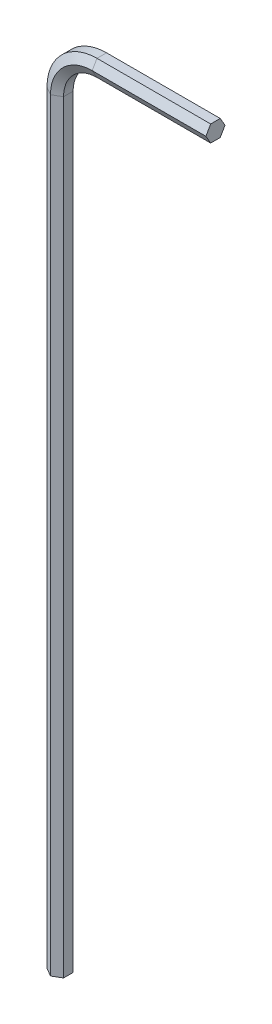
ISO-10303-21;
HEADER;
FILE_DESCRIPTION(('STEP AP214'),'2;1');
FILE_NAME('part.step','',(''),(''),'','','');
FILE_SCHEMA(('AUTOMOTIVE_DESIGN { 1 0 10303 214 1 1 1 1 }'));
ENDSEC;
DATA;
#1=APPLICATION_CONTEXT('core data for automotive mechanical design processes');
#2=APPLICATION_PROTOCOL_DEFINITION('international standard','automotive_design',2000,#1);
#3=PRODUCT_CONTEXT('',#1,'mechanical');
#4=PRODUCT('Part','Part','',(#3));
#5=PRODUCT_RELATED_PRODUCT_CATEGORY('part','',(#4));
#6=PRODUCT_DEFINITION_FORMATION('','',#4);
#7=PRODUCT_DEFINITION_CONTEXT('part definition',#1,'design');
#8=PRODUCT_DEFINITION('design','',#6,#7);
#9=PRODUCT_DEFINITION_SHAPE('','',#8);
#10=(LENGTH_UNIT() NAMED_UNIT(*) SI_UNIT(.MILLI.,.METRE.));
#11=(NAMED_UNIT(*) PLANE_ANGLE_UNIT() SI_UNIT($,.RADIAN.));
#12=(NAMED_UNIT(*) SI_UNIT($,.STERADIAN.) SOLID_ANGLE_UNIT());
#13=UNCERTAINTY_MEASURE_WITH_UNIT(LENGTH_MEASURE(1.E-05),#10,'distance_accuracy_value','');
#14=(GEOMETRIC_REPRESENTATION_CONTEXT(3) GLOBAL_UNCERTAINTY_ASSIGNED_CONTEXT((#13)) GLOBAL_UNIT_ASSIGNED_CONTEXT((#10,
#11,#12)) REPRESENTATION_CONTEXT('',''));
#15=CARTESIAN_POINT('',(0.,0.,0.));
#16=DIRECTION('',(0.,0.,1.));
#17=DIRECTION('',(1.,0.,0.));
#18=AXIS2_PLACEMENT_3D('',#15,#16,#17);
#19=CARTESIAN_POINT('',(4.00000000000003,77.20625,-0.91654355233853));
#20=DIRECTION('',(0.,0.500000000000001,-0.866025403784438));
#21=DIRECTION('',(0.,0.866025403784438,0.500000000000001));
#22=AXIS2_PLACEMENT_3D('',#19,#20,#21);
#23=PLANE('',#22);
#24=DIRECTION('',(0.,0.866025403784438,0.500000000000001));
#25=VECTOR('',#24,1.);
#26=CARTESIAN_POINT('',(4.00000000000003,77.20625,-0.91654355233853));
#27=LINE('',#26,#25);
#28=CARTESIAN_POINT('',(4.00000000000003,77.20625,-0.91654355233853));
#29=VERTEX_POINT('',#28);
#30=CARTESIAN_POINT('',(4.00000000000005,78.,-0.458271776169263));
#31=VERTEX_POINT('',#30);
#32=EDGE_CURVE('E131',#29,#31,#27,.T.);
#33=ORIENTED_EDGE('',*,*,#32,.T.);
#34=DIRECTION('',(1.,0.,0.));
#35=VECTOR('',#34,1.);
#36=CARTESIAN_POINT('',(4.00000000000005,78.,-0.458271776169263));
#37=LINE('',#36,#35);
#38=CARTESIAN_POINT('',(14.90625,78.,-0.458271776169263));
#39=VERTEX_POINT('',#38);
#40=EDGE_CURVE('E40',#31,#39,#37,.T.);
#41=ORIENTED_EDGE('',*,*,#40,.T.);
#42=DIRECTION('',(0.,0.866025403784438,0.500000000000001));
#43=VECTOR('',#42,1.);
#44=CARTESIAN_POINT('',(14.90625,77.20625,-0.91654355233853));
#45=LINE('',#44,#43);
#46=CARTESIAN_POINT('',(14.90625,77.20625,-0.91654355233853));
#47=VERTEX_POINT('',#46);
#48=EDGE_CURVE('E47',#47,#39,#45,.T.);
#49=ORIENTED_EDGE('',*,*,#48,.F.);
#50=DIRECTION('',(1.,0.,0.));
#51=VECTOR('',#50,1.);
#52=CARTESIAN_POINT('',(4.00000000000003,77.20625,-0.91654355233853));
#53=LINE('',#52,#51);
#54=EDGE_CURVE('E11',#29,#47,#53,.T.);
#55=ORIENTED_EDGE('',*,*,#54,.F.);
#56=EDGE_LOOP('',(#33,#41,#49,#55));
#57=FACE_BOUND('',#56,.T.);
#58=ADVANCED_FACE('F33',(#57),#23,.T.);
#59=CARTESIAN_POINT('',(4.00000000000005,78.,-0.458271776169263));
#60=DIRECTION('',(0.,1.,0.));
#61=DIRECTION('',(0.,0.,1.));
#62=AXIS2_PLACEMENT_3D('',#59,#60,#61);
#63=PLANE('',#62);
#64=DIRECTION('',(0.,0.,1.));
#65=VECTOR('',#64,1.);
#66=CARTESIAN_POINT('',(4.00000000000005,78.,-0.458271776169263));
#67=LINE('',#66,#65);
#68=CARTESIAN_POINT('',(4.00000000000005,78.,0.458271776169269));
#69=VERTEX_POINT('',#68);
#70=EDGE_CURVE('E178',#31,#69,#67,.T.);
#71=ORIENTED_EDGE('',*,*,#70,.T.);
#72=DIRECTION('',(1.,0.,0.));
#73=VECTOR('',#72,1.);
#74=CARTESIAN_POINT('',(4.00000000000005,78.,0.458271776169269));
#75=LINE('',#74,#73);
#76=CARTESIAN_POINT('',(14.90625,78.,0.458271776169269));
#77=VERTEX_POINT('',#76);
#78=EDGE_CURVE('E214',#69,#77,#75,.T.);
#79=ORIENTED_EDGE('',*,*,#78,.T.);
#80=DIRECTION('',(0.,0.,1.));
#81=VECTOR('',#80,1.);
#82=CARTESIAN_POINT('',(14.90625,78.,-0.458271776169263));
#83=LINE('',#82,#81);
#84=EDGE_CURVE('E55',#39,#77,#83,.T.);
#85=ORIENTED_EDGE('',*,*,#84,.F.);
#86=ORIENTED_EDGE('',*,*,#40,.F.);
#87=EDGE_LOOP('',(#71,#79,#85,#86));
#88=FACE_BOUND('',#87,.T.);
#89=ADVANCED_FACE('F216',(#88),#63,.T.);
#90=CARTESIAN_POINT('',(4.00000000000005,78.,0.458271776169269));
#91=DIRECTION('',(0.,0.499999999999995,0.866025403784442));
#92=DIRECTION('',(0.,-0.866025403784442,0.499999999999995));
#93=AXIS2_PLACEMENT_3D('',#90,#91,#92);
#94=PLANE('',#93);
#95=DIRECTION('',(0.,-0.866025403784442,0.499999999999995));
#96=VECTOR('',#95,1.);
#97=CARTESIAN_POINT('',(4.00000000000005,78.,0.458271776169269));
#98=LINE('',#97,#96);
#99=CARTESIAN_POINT('',(4.00000000000003,77.20625,0.91654355233853));
#100=VERTEX_POINT('',#99);
#101=EDGE_CURVE('E175',#69,#100,#98,.T.);
#102=ORIENTED_EDGE('',*,*,#101,.T.);
#103=DIRECTION('',(1.,0.,0.));
#104=VECTOR('',#103,1.);
#105=CARTESIAN_POINT('',(4.00000000000003,77.20625,0.91654355233853));
#106=LINE('',#105,#104);
#107=CARTESIAN_POINT('',(14.90625,77.20625,0.91654355233853));
#108=VERTEX_POINT('',#107);
#109=EDGE_CURVE('E211',#100,#108,#106,.T.);
#110=ORIENTED_EDGE('',*,*,#109,.T.);
#111=DIRECTION('',(0.,-0.866025403784442,0.499999999999995));
#112=VECTOR('',#111,1.);
#113=CARTESIAN_POINT('',(14.90625,78.,0.458271776169269));
#114=LINE('',#113,#112);
#115=EDGE_CURVE('E200',#77,#108,#114,.T.);
#116=ORIENTED_EDGE('',*,*,#115,.F.);
#117=ORIENTED_EDGE('',*,*,#78,.F.);
#118=EDGE_LOOP('',(#102,#110,#116,#117));
#119=FACE_BOUND('',#118,.T.);
#120=ADVANCED_FACE('F281',(#119),#94,.T.);
#121=CARTESIAN_POINT('',(4.00000000000003,77.20625,0.91654355233853));
#122=DIRECTION('',(0.,-0.500000000000007,0.866025403784435));
#123=DIRECTION('',(0.,-0.866025403784435,-0.500000000000007));
#124=AXIS2_PLACEMENT_3D('',#121,#122,#123);
#125=PLANE('',#124);
#126=DIRECTION('',(0.,-0.866025403784435,-0.500000000000007));
#127=VECTOR('',#126,1.);
#128=CARTESIAN_POINT('',(4.00000000000003,77.20625,0.91654355233853));
#129=LINE('',#128,#127);
#130=CARTESIAN_POINT('',(4.00000000000002,76.4125,0.458271776169257));
#131=VERTEX_POINT('',#130);
#132=EDGE_CURVE('E172',#100,#131,#129,.T.);
#133=ORIENTED_EDGE('',*,*,#132,.T.);
#134=DIRECTION('',(1.,0.,0.));
#135=VECTOR('',#134,1.);
#136=CARTESIAN_POINT('',(4.00000000000002,76.4125,0.458271776169257));
#137=LINE('',#136,#135);
#138=CARTESIAN_POINT('',(14.90625,76.4125,0.458271776169257));
#139=VERTEX_POINT('',#138);
#140=EDGE_CURVE('E208',#131,#139,#137,.T.);
#141=ORIENTED_EDGE('',*,*,#140,.T.);
#142=DIRECTION('',(0.,-0.866025403784435,-0.500000000000007));
#143=VECTOR('',#142,1.);
#144=CARTESIAN_POINT('',(14.90625,77.20625,0.91654355233853));
#145=LINE('',#144,#143);
#146=EDGE_CURVE('E197',#108,#139,#145,.T.);
#147=ORIENTED_EDGE('',*,*,#146,.F.);
#148=ORIENTED_EDGE('',*,*,#109,.F.);
#149=EDGE_LOOP('',(#133,#141,#147,#148));
#150=FACE_BOUND('',#149,.T.);
#151=ADVANCED_FACE('F280',(#150),#125,.T.);
#152=CARTESIAN_POINT('',(4.00000000000002,76.4125,0.458271776169257));
#153=DIRECTION('',(0.,-1.,0.));
#154=DIRECTION('',(0.,0.,-1.));
#155=AXIS2_PLACEMENT_3D('',#152,#153,#154);
#156=PLANE('',#155);
#157=DIRECTION('',(0.,0.,-1.));
#158=VECTOR('',#157,1.);
#159=CARTESIAN_POINT('',(4.00000000000002,76.4125,0.458271776169257));
#160=LINE('',#159,#158);
#161=CARTESIAN_POINT('',(4.00000000000002,76.4125,-0.458271776169274));
#162=VERTEX_POINT('',#161);
#163=EDGE_CURVE('E164',#131,#162,#160,.T.);
#164=ORIENTED_EDGE('',*,*,#163,.T.);
#165=DIRECTION('',(1.,0.,0.));
#166=VECTOR('',#165,1.);
#167=CARTESIAN_POINT('',(4.00000000000002,76.4125,-0.458271776169274));
#168=LINE('',#167,#166);
#169=CARTESIAN_POINT('',(14.90625,76.4125,-0.458271776169274));
#170=VERTEX_POINT('',#169);
#171=EDGE_CURVE('E205',#162,#170,#168,.T.);
#172=ORIENTED_EDGE('',*,*,#171,.T.);
#173=DIRECTION('',(0.,0.,-1.));
#174=VECTOR('',#173,1.);
#175=CARTESIAN_POINT('',(14.90625,76.4125,0.458271776169257));
#176=LINE('',#175,#174);
#177=EDGE_CURVE('E194',#139,#170,#176,.T.);
#178=ORIENTED_EDGE('',*,*,#177,.F.);
#179=ORIENTED_EDGE('',*,*,#140,.F.);
#180=EDGE_LOOP('',(#164,#172,#178,#179));
#181=FACE_BOUND('',#180,.T.);
#182=ADVANCED_FACE('F287',(#181),#156,.T.);
#183=CARTESIAN_POINT('',(4.00000000000002,76.4125,-0.458271776169274));
#184=DIRECTION('',(0.,-0.499999999999995,-0.866025403784442));
#185=DIRECTION('',(0.,0.866025403784442,-0.499999999999995));
#186=AXIS2_PLACEMENT_3D('',#183,#184,#185);
#187=PLANE('',#186);
#188=DIRECTION('',(0.,0.866025403784442,-0.499999999999995));
#189=VECTOR('',#188,1.);
#190=CARTESIAN_POINT('',(4.00000000000002,76.4125,-0.458271776169274));
#191=LINE('',#190,#189);
#192=EDGE_CURVE('E161',#162,#29,#191,.T.);
#193=ORIENTED_EDGE('',*,*,#192,.T.);
#194=ORIENTED_EDGE('',*,*,#54,.T.);
#195=DIRECTION('',(0.,0.866025403784442,-0.499999999999995));
#196=VECTOR('',#195,1.);
#197=CARTESIAN_POINT('',(14.90625,76.4125,-0.458271776169274));
#198=LINE('',#197,#196);
#199=EDGE_CURVE('E134',#170,#47,#198,.T.);
#200=ORIENTED_EDGE('',*,*,#199,.F.);
#201=ORIENTED_EDGE('',*,*,#171,.F.);
#202=EDGE_LOOP('',(#193,#194,#200,#201));
#203=FACE_BOUND('',#202,.T.);
#204=ADVANCED_FACE('F285',(#203),#187,.T.);
#205=CARTESIAN_POINT('',(4.,73.20625,-0.91654355233853));
#206=DIRECTION('',(0.,0.,1.));
#207=DIRECTION('',(1.,0.,0.));
#208=AXIS2_PLACEMENT_3D('',#205,#206,#207);
#209=CONICAL_SURFACE('',#208,4.,1.0471975511966);
#210=DIRECTION('',(-0.866025403784438,0.,0.500000000000001));
#211=VECTOR('',#210,1.);
#212=CARTESIAN_POINT('',(0.,73.20625,-0.91654355233853));
#213=LINE('',#212,#211);
#214=CARTESIAN_POINT('',(0.,73.20625,-0.91654355233853));
#215=VERTEX_POINT('',#214);
#216=CARTESIAN_POINT('',(-0.79375,73.20625,-0.458271776169263));
#217=VERTEX_POINT('',#216);
#218=EDGE_CURVE('E128',#215,#217,#213,.T.);
#219=ORIENTED_EDGE('',*,*,#218,.T.);
#220=CARTESIAN_POINT('',(4.,73.20625,-0.458271776169263));
#221=DIRECTION('',(0.,0.,-1.));
#222=DIRECTION('',(-1.,0.,0.));
#223=AXIS2_PLACEMENT_3D('',#220,#221,#222);
#224=CIRCLE('',#223,4.79375);
#225=EDGE_CURVE('E135',#217,#31,#224,.T.);
#226=ORIENTED_EDGE('',*,*,#225,.T.);
#227=ORIENTED_EDGE('',*,*,#32,.F.);
#228=CARTESIAN_POINT('',(4.,73.20625,-0.91654355233853));
#229=DIRECTION('',(0.,0.,-1.));
#230=DIRECTION('',(-1.,0.,0.));
#231=AXIS2_PLACEMENT_3D('',#228,#229,#230);
#232=CIRCLE('',#231,4.);
#233=EDGE_CURVE('E123',#215,#29,#232,.T.);
#234=ORIENTED_EDGE('',*,*,#233,.F.);
#235=EDGE_LOOP('',(#219,#226,#227,#234));
#236=FACE_BOUND('',#235,.T.);
#237=ADVANCED_FACE('F125',(#236),#209,.T.);
#238=CARTESIAN_POINT('',(4.,73.20625,0.));
#239=DIRECTION('',(0.,0.,-1.));
#240=DIRECTION('',(-1.,0.,0.));
#241=AXIS2_PLACEMENT_3D('',#238,#239,#240);
#242=CYLINDRICAL_SURFACE('',#241,4.79375);
#243=DIRECTION('',(0.,0.,1.));
#244=VECTOR('',#243,1.);
#245=CARTESIAN_POINT('',(-0.79375,73.20625,-0.458271776169263));
#246=LINE('',#245,#244);
#247=CARTESIAN_POINT('',(-0.793749999999997,73.20625,0.458271776169269));
#248=VERTEX_POINT('',#247);
#249=EDGE_CURVE('E156',#217,#248,#246,.T.);
#250=ORIENTED_EDGE('',*,*,#249,.T.);
#251=CARTESIAN_POINT('',(4.,73.20625,0.458271776169269));
#252=DIRECTION('',(0.,0.,-1.));
#253=DIRECTION('',(-1.,0.,0.));
#254=AXIS2_PLACEMENT_3D('',#251,#252,#253);
#255=CIRCLE('',#254,4.79375);
#256=EDGE_CURVE('E189',#248,#69,#255,.T.);
#257=ORIENTED_EDGE('',*,*,#256,.T.);
#258=ORIENTED_EDGE('',*,*,#70,.F.);
#259=ORIENTED_EDGE('',*,*,#225,.F.);
#260=EDGE_LOOP('',(#250,#257,#258,#259));
#261=FACE_BOUND('',#260,.T.);
#262=ADVANCED_FACE('F225',(#261),#242,.T.);
#263=CARTESIAN_POINT('',(4.,73.20625,0.458271776169269));
#264=DIRECTION('',(0.,0.,-1.));
#265=DIRECTION('',(-1.,0.,0.));
#266=AXIS2_PLACEMENT_3D('',#263,#264,#265);
#267=CONICAL_SURFACE('',#266,4.79375,1.0471975511966);
#268=DIRECTION('',(0.866025403784442,0.,0.499999999999995));
#269=VECTOR('',#268,1.);
#270=CARTESIAN_POINT('',(-0.793749999999997,73.20625,0.458271776169269));
#271=LINE('',#270,#269);
#272=CARTESIAN_POINT('',(0.,73.20625,0.91654355233853));
#273=VERTEX_POINT('',#272);
#274=EDGE_CURVE('E228',#248,#273,#271,.T.);
#275=ORIENTED_EDGE('',*,*,#274,.T.);
#276=CARTESIAN_POINT('',(4.,73.20625,0.91654355233853));
#277=DIRECTION('',(0.,0.,-1.));
#278=DIRECTION('',(-1.,0.,0.));
#279=AXIS2_PLACEMENT_3D('',#276,#277,#278);
#280=CIRCLE('',#279,3.99999999999999);
#281=EDGE_CURVE('E186',#273,#100,#280,.T.);
#282=ORIENTED_EDGE('',*,*,#281,.T.);
#283=ORIENTED_EDGE('',*,*,#101,.F.);
#284=ORIENTED_EDGE('',*,*,#256,.F.);
#285=EDGE_LOOP('',(#275,#282,#283,#284));
#286=FACE_BOUND('',#285,.T.);
#287=ADVANCED_FACE('F221',(#286),#267,.T.);
#288=CARTESIAN_POINT('',(4.,73.20625,0.91654355233853));
#289=DIRECTION('',(0.,0.,1.));
#290=DIRECTION('',(1.,0.,0.));
#291=AXIS2_PLACEMENT_3D('',#288,#289,#290);
#292=CONICAL_SURFACE('',#291,3.99999999999999,1.04719755119659);
#293=DIRECTION('',(0.866025403784435,0.,-0.500000000000007));
#294=VECTOR('',#293,1.);
#295=CARTESIAN_POINT('',(0.,73.20625,0.91654355233853));
#296=LINE('',#295,#294);
#297=CARTESIAN_POINT('',(0.793750000000003,73.20625,0.458271776169257));
#298=VERTEX_POINT('',#297);
#299=EDGE_CURVE('E242',#273,#298,#296,.T.);
#300=ORIENTED_EDGE('',*,*,#299,.T.);
#301=CARTESIAN_POINT('',(4.,73.20625,0.458271776169257));
#302=DIRECTION('',(0.,0.,-1.));
#303=DIRECTION('',(-1.,0.,0.));
#304=AXIS2_PLACEMENT_3D('',#301,#302,#303);
#305=CIRCLE('',#304,3.20625);
#306=EDGE_CURVE('E183',#298,#131,#305,.T.);
#307=ORIENTED_EDGE('',*,*,#306,.T.);
#308=ORIENTED_EDGE('',*,*,#132,.F.);
#309=ORIENTED_EDGE('',*,*,#281,.F.);
#310=EDGE_LOOP('',(#300,#307,#308,#309));
#311=FACE_BOUND('',#310,.T.);
#312=ADVANCED_FACE('F278',(#311),#292,.F.);
#313=CARTESIAN_POINT('',(4.,73.20625,0.));
#314=DIRECTION('',(0.,0.,-1.));
#315=DIRECTION('',(-1.,0.,0.));
#316=AXIS2_PLACEMENT_3D('',#313,#314,#315);
#317=CYLINDRICAL_SURFACE('',#316,3.20625);
#318=DIRECTION('',(0.,0.,-1.));
#319=VECTOR('',#318,1.);
#320=CARTESIAN_POINT('',(0.793750000000003,73.20625,0.458271776169257));
#321=LINE('',#320,#319);
#322=CARTESIAN_POINT('',(0.793749999999994,73.20625,-0.458271776169274));
#323=VERTEX_POINT('',#322);
#324=EDGE_CURVE('E245',#298,#323,#321,.T.);
#325=ORIENTED_EDGE('',*,*,#324,.T.);
#326=CARTESIAN_POINT('',(4.,73.20625,-0.458271776169274));
#327=DIRECTION('',(0.,0.,-1.));
#328=DIRECTION('',(-1.,0.,0.));
#329=AXIS2_PLACEMENT_3D('',#326,#327,#328);
#330=CIRCLE('',#329,3.20625000000001);
#331=EDGE_CURVE('E141',#323,#162,#330,.T.);
#332=ORIENTED_EDGE('',*,*,#331,.T.);
#333=ORIENTED_EDGE('',*,*,#163,.F.);
#334=ORIENTED_EDGE('',*,*,#306,.F.);
#335=EDGE_LOOP('',(#325,#332,#333,#334));
#336=FACE_BOUND('',#335,.T.);
#337=ADVANCED_FACE('F275',(#336),#317,.F.);
#338=CARTESIAN_POINT('',(4.,73.20625,-0.458271776169274));
#339=DIRECTION('',(0.,0.,-1.));
#340=DIRECTION('',(-1.,0.,0.));
#341=AXIS2_PLACEMENT_3D('',#338,#339,#340);
#342=CONICAL_SURFACE('',#341,3.20625000000001,1.0471975511966);
#343=DIRECTION('',(-0.866025403784442,0.,-0.499999999999995));
#344=VECTOR('',#343,1.);
#345=CARTESIAN_POINT('',(0.793749999999994,73.20625,-0.458271776169274));
#346=LINE('',#345,#344);
#347=EDGE_CURVE('E138',#323,#215,#346,.T.);
#348=ORIENTED_EDGE('',*,*,#347,.T.);
#349=ORIENTED_EDGE('',*,*,#233,.T.);
#350=ORIENTED_EDGE('',*,*,#192,.F.);
#351=ORIENTED_EDGE('',*,*,#331,.F.);
#352=EDGE_LOOP('',(#348,#349,#350,#351));
#353=FACE_BOUND('',#352,.T.);
#354=ADVANCED_FACE('F139',(#353),#342,.F.);
#355=CARTESIAN_POINT('',(0.793749999999994,73.20625,-0.458271776169274));
#356=DIRECTION('',(-0.499999999999995,0.,0.866025403784441));
#357=DIRECTION('',(0.866025403784442,0.,0.499999999999995));
#358=AXIS2_PLACEMENT_3D('',#355,#356,#357);
#359=PLANE('',#358);
#360=DIRECTION('',(-0.866025403784442,0.,-0.499999999999995));
#361=VECTOR('',#360,1.);
#362=CARTESIAN_POINT('',(0.793749999999994,0.,-0.458271776169274));
#363=LINE('',#362,#361);
#364=CARTESIAN_POINT('',(0.793749999999994,0.,-0.458271776169274));
#365=VERTEX_POINT('',#364);
#366=CARTESIAN_POINT('',(0.,0.,-0.91654355233853));
#367=VERTEX_POINT('',#366);
#368=EDGE_CURVE('E160',#365,#367,#363,.T.);
#369=ORIENTED_EDGE('',*,*,#368,.T.);
#370=DIRECTION('',(0.,-1.,0.));
#371=VECTOR('',#370,1.);
#372=CARTESIAN_POINT('',(0.,73.20625,-0.91654355233853));
#373=LINE('',#372,#371);
#374=EDGE_CURVE('E151',#215,#367,#373,.T.);
#375=ORIENTED_EDGE('',*,*,#374,.F.);
#376=ORIENTED_EDGE('',*,*,#347,.F.);
#377=DIRECTION('',(0.,-1.,0.));
#378=VECTOR('',#377,1.);
#379=CARTESIAN_POINT('',(0.793749999999994,73.20625,-0.458271776169274));
#380=LINE('',#379,#378);
#381=EDGE_CURVE('E249',#323,#365,#380,.T.);
#382=ORIENTED_EDGE('',*,*,#381,.T.);
#383=EDGE_LOOP('',(#369,#375,#376,#382));
#384=FACE_BOUND('',#383,.T.);
#385=ADVANCED_FACE('F158',(#384),#359,.F.);
#386=CARTESIAN_POINT('',(0.,73.20625,-0.91654355233853));
#387=DIRECTION('',(0.500000000000001,0.,0.866025403784438));
#388=DIRECTION('',(0.866025403784438,0.,-0.500000000000001));
#389=AXIS2_PLACEMENT_3D('',#386,#387,#388);
#390=PLANE('',#389);
#391=DIRECTION('',(-0.866025403784438,0.,0.500000000000001));
#392=VECTOR('',#391,1.);
#393=CARTESIAN_POINT('',(0.,0.,-0.91654355233853));
#394=LINE('',#393,#392);
#395=CARTESIAN_POINT('',(-0.79375,0.,-0.458271776169263));
#396=VERTEX_POINT('',#395);
#397=EDGE_CURVE('E251',#367,#396,#394,.T.);
#398=ORIENTED_EDGE('',*,*,#397,.T.);
#399=DIRECTION('',(0.,-1.,0.));
#400=VECTOR('',#399,1.);
#401=CARTESIAN_POINT('',(-0.79375,73.20625,-0.458271776169263));
#402=LINE('',#401,#400);
#403=EDGE_CURVE('E154',#217,#396,#402,.T.);
#404=ORIENTED_EDGE('',*,*,#403,.F.);
#405=ORIENTED_EDGE('',*,*,#218,.F.);
#406=ORIENTED_EDGE('',*,*,#374,.T.);
#407=EDGE_LOOP('',(#398,#404,#405,#406));
#408=FACE_BOUND('',#407,.T.);
#409=ADVANCED_FACE('F150',(#408),#390,.F.);
#410=CARTESIAN_POINT('',(-0.79375,73.20625,-0.458271776169263));
#411=DIRECTION('',(1.,0.,0.));
#412=DIRECTION('',(0.,0.,-1.));
#413=AXIS2_PLACEMENT_3D('',#410,#411,#412);
#414=PLANE('',#413);
#415=DIRECTION('',(0.,0.,1.));
#416=VECTOR('',#415,1.);
#417=CARTESIAN_POINT('',(-0.79375,0.,-0.458271776169263));
#418=LINE('',#417,#416);
#419=CARTESIAN_POINT('',(-0.793749999999997,0.,0.458271776169269));
#420=VERTEX_POINT('',#419);
#421=EDGE_CURVE('E234',#396,#420,#418,.T.);
#422=ORIENTED_EDGE('',*,*,#421,.T.);
#423=DIRECTION('',(0.,-1.,0.));
#424=VECTOR('',#423,1.);
#425=CARTESIAN_POINT('',(-0.793749999999997,73.20625,0.458271776169269));
#426=LINE('',#425,#424);
#427=EDGE_CURVE('E166',#248,#420,#426,.T.);
#428=ORIENTED_EDGE('',*,*,#427,.F.);
#429=ORIENTED_EDGE('',*,*,#249,.F.);
#430=ORIENTED_EDGE('',*,*,#403,.T.);
#431=EDGE_LOOP('',(#422,#428,#429,#430));
#432=FACE_BOUND('',#431,.T.);
#433=ADVANCED_FACE('F232',(#432),#414,.F.);
#434=CARTESIAN_POINT('',(-0.793749999999997,73.20625,0.458271776169269));
#435=DIRECTION('',(0.499999999999995,0.,-0.866025403784442));
#436=DIRECTION('',(-0.866025403784442,0.,-0.499999999999995));
#437=AXIS2_PLACEMENT_3D('',#434,#435,#436);
#438=PLANE('',#437);
#439=DIRECTION('',(0.866025403784442,0.,0.499999999999995));
#440=VECTOR('',#439,1.);
#441=CARTESIAN_POINT('',(-0.793749999999997,0.,0.458271776169269));
#442=LINE('',#441,#440);
#443=CARTESIAN_POINT('',(0.,0.,0.91654355233853));
#444=VERTEX_POINT('',#443);
#445=EDGE_CURVE('E254',#420,#444,#442,.T.);
#446=ORIENTED_EDGE('',*,*,#445,.T.);
#447=DIRECTION('',(0.,-1.,0.));
#448=VECTOR('',#447,1.);
#449=CARTESIAN_POINT('',(0.,73.20625,0.91654355233853));
#450=LINE('',#449,#448);
#451=EDGE_CURVE('E237',#273,#444,#450,.T.);
#452=ORIENTED_EDGE('',*,*,#451,.F.);
#453=ORIENTED_EDGE('',*,*,#274,.F.);
#454=ORIENTED_EDGE('',*,*,#427,.T.);
#455=EDGE_LOOP('',(#446,#452,#453,#454));
#456=FACE_BOUND('',#455,.T.);
#457=ADVANCED_FACE('F239',(#456),#438,.F.);
#458=CARTESIAN_POINT('',(0.,73.20625,0.91654355233853));
#459=DIRECTION('',(-0.500000000000007,0.,-0.866025403784435));
#460=DIRECTION('',(-0.866025403784435,0.,0.500000000000007));
#461=AXIS2_PLACEMENT_3D('',#458,#459,#460);
#462=PLANE('',#461);
#463=DIRECTION('',(0.866025403784435,0.,-0.500000000000007));
#464=VECTOR('',#463,1.);
#465=CARTESIAN_POINT('',(0.,0.,0.91654355233853));
#466=LINE('',#465,#464);
#467=CARTESIAN_POINT('',(0.793750000000003,0.,0.458271776169257));
#468=VERTEX_POINT('',#467);
#469=EDGE_CURVE('E256',#444,#468,#466,.T.);
#470=ORIENTED_EDGE('',*,*,#469,.T.);
#471=DIRECTION('',(0.,-1.,0.));
#472=VECTOR('',#471,1.);
#473=CARTESIAN_POINT('',(0.793750000000003,73.20625,0.458271776169257));
#474=LINE('',#473,#472);
#475=EDGE_CURVE('E260',#298,#468,#474,.T.);
#476=ORIENTED_EDGE('',*,*,#475,.F.);
#477=ORIENTED_EDGE('',*,*,#299,.F.);
#478=ORIENTED_EDGE('',*,*,#451,.T.);
#479=EDGE_LOOP('',(#470,#476,#477,#478));
#480=FACE_BOUND('',#479,.T.);
#481=ADVANCED_FACE('F265',(#480),#462,.F.);
#482=CARTESIAN_POINT('',(0.793750000000003,73.20625,0.458271776169257));
#483=DIRECTION('',(-1.,0.,0.));
#484=DIRECTION('',(0.,0.,1.));
#485=AXIS2_PLACEMENT_3D('',#482,#483,#484);
#486=PLANE('',#485);
#487=DIRECTION('',(0.,0.,-1.));
#488=VECTOR('',#487,1.);
#489=CARTESIAN_POINT('',(0.793750000000003,0.,0.458271776169257));
#490=LINE('',#489,#488);
#491=EDGE_CURVE('E146',#468,#365,#490,.T.);
#492=ORIENTED_EDGE('',*,*,#491,.T.);
#493=ORIENTED_EDGE('',*,*,#381,.F.);
#494=ORIENTED_EDGE('',*,*,#324,.F.);
#495=ORIENTED_EDGE('',*,*,#475,.T.);
#496=EDGE_LOOP('',(#492,#493,#494,#495));
#497=FACE_BOUND('',#496,.T.);
#498=ADVANCED_FACE('F272',(#497),#486,.F.);
#499=CARTESIAN_POINT('',(14.90625,77.20625,0.));
#500=DIRECTION('',(1.,0.,0.));
#501=DIRECTION('',(0.,0.,1.));
#502=AXIS2_PLACEMENT_3D('',#499,#500,#501);
#503=PLANE('',#502);
#504=ORIENTED_EDGE('',*,*,#199,.T.);
#505=ORIENTED_EDGE('',*,*,#48,.T.);
#506=ORIENTED_EDGE('',*,*,#84,.T.);
#507=ORIENTED_EDGE('',*,*,#115,.T.);
#508=ORIENTED_EDGE('',*,*,#146,.T.);
#509=ORIENTED_EDGE('',*,*,#177,.T.);
#510=EDGE_LOOP('',(#504,#505,#506,#507,#508,#509));
#511=FACE_BOUND('',#510,.T.);
#512=ADVANCED_FACE('F283',(#511),#503,.T.);
#513=CARTESIAN_POINT('',(0.,0.,0.));
#514=DIRECTION('',(0.,1.,0.));
#515=DIRECTION('',(0.,0.,1.));
#516=AXIS2_PLACEMENT_3D('',#513,#514,#515);
#517=PLANE('',#516);
#518=ORIENTED_EDGE('',*,*,#368,.F.);
#519=ORIENTED_EDGE('',*,*,#491,.F.);
#520=ORIENTED_EDGE('',*,*,#469,.F.);
#521=ORIENTED_EDGE('',*,*,#445,.F.);
#522=ORIENTED_EDGE('',*,*,#421,.F.);
#523=ORIENTED_EDGE('',*,*,#397,.F.);
#524=EDGE_LOOP('',(#518,#519,#520,#521,#522,#523));
#525=FACE_BOUND('',#524,.T.);
#526=ADVANCED_FACE('F269',(#525),#517,.F.);
#527=CLOSED_SHELL('',(#58,#89,#120,#151,#182,#204,#237,#262,#287,#312,#337,#354,#385,#409,#433,
#457,#481,#498,#512,#526));
#528=MANIFOLD_SOLID_BREP('B2',#527);
#529=ADVANCED_BREP_SHAPE_REPRESENTATION('',(#18,#528),#14);
#530=SHAPE_DEFINITION_REPRESENTATION(#9,#529);
ENDSEC;
END-ISO-10303-21;
